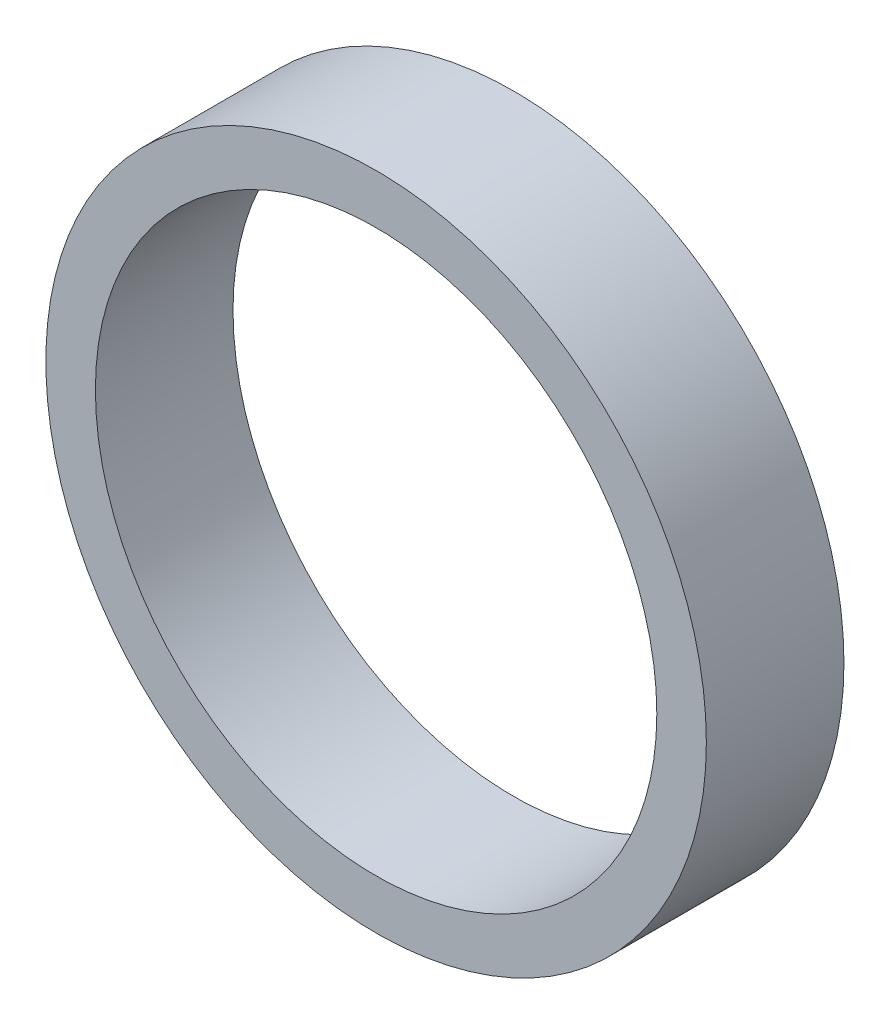
ISO-10303-21;
HEADER;
FILE_DESCRIPTION(('STEP AP214'),'2;1');
FILE_NAME('part.step','',(''),(''),'','','');
FILE_SCHEMA(('AUTOMOTIVE_DESIGN { 1 0 10303 214 1 1 1 1 }'));
ENDSEC;
DATA;
#1=APPLICATION_CONTEXT('core data for automotive mechanical design processes');
#2=APPLICATION_PROTOCOL_DEFINITION('international standard','automotive_design',2000,#1);
#3=PRODUCT_CONTEXT('',#1,'mechanical');
#4=PRODUCT('Part','Part','',(#3));
#5=PRODUCT_RELATED_PRODUCT_CATEGORY('part','',(#4));
#6=PRODUCT_DEFINITION_FORMATION('','',#4);
#7=PRODUCT_DEFINITION_CONTEXT('part definition',#1,'design');
#8=PRODUCT_DEFINITION('design','',#6,#7);
#9=PRODUCT_DEFINITION_SHAPE('','',#8);
#10=(LENGTH_UNIT() NAMED_UNIT(*) SI_UNIT(.MILLI.,.METRE.));
#11=(NAMED_UNIT(*) PLANE_ANGLE_UNIT() SI_UNIT($,.RADIAN.));
#12=(NAMED_UNIT(*) SI_UNIT($,.STERADIAN.) SOLID_ANGLE_UNIT());
#13=UNCERTAINTY_MEASURE_WITH_UNIT(LENGTH_MEASURE(1.E-05),#10,'distance_accuracy_value','');
#14=(GEOMETRIC_REPRESENTATION_CONTEXT(3) GLOBAL_UNCERTAINTY_ASSIGNED_CONTEXT((#13)) GLOBAL_UNIT_ASSIGNED_CONTEXT((#10,
#11,#12)) REPRESENTATION_CONTEXT('',''));
#15=CARTESIAN_POINT('',(0.,0.,0.));
#16=DIRECTION('',(0.,0.,1.));
#17=DIRECTION('',(1.,0.,0.));
#18=AXIS2_PLACEMENT_3D('',#15,#16,#17);
#19=CARTESIAN_POINT('',(0.,0.,2.5));
#20=DIRECTION('',(0.,0.,1.));
#21=DIRECTION('',(1.,0.,0.));
#22=AXIS2_PLACEMENT_3D('',#19,#20,#21);
#23=PLANE('',#22);
#24=CARTESIAN_POINT('',(0.,0.,2.5));
#25=DIRECTION('',(0.,0.,1.));
#26=DIRECTION('',(1.,0.,0.));
#27=AXIS2_PLACEMENT_3D('',#24,#25,#26);
#28=CIRCLE('',#27,6.);
#29=CARTESIAN_POINT('',(6.,0.,2.5));
#30=VERTEX_POINT('',#29);
#31=EDGE_CURVE('E10',#30,#30,#28,.T.);
#32=ORIENTED_EDGE('',*,*,#31,.T.);
#33=EDGE_LOOP('',(#32));
#34=FACE_BOUND('',#33,.T.);
#35=CARTESIAN_POINT('',(0.,0.,2.5));
#36=DIRECTION('',(0.,0.,1.));
#37=DIRECTION('',(1.,0.,0.));
#38=AXIS2_PLACEMENT_3D('',#35,#36,#37);
#39=CIRCLE('',#38,5.1);
#40=CARTESIAN_POINT('',(5.1,0.,2.5));
#41=VERTEX_POINT('',#40);
#42=EDGE_CURVE('E64',#41,#41,#39,.T.);
#43=ORIENTED_EDGE('',*,*,#42,.F.);
#44=EDGE_LOOP('',(#43));
#45=FACE_BOUND('',#44,.T.);
#46=ADVANCED_FACE('F49',(#34,#45),#23,.T.);
#47=CARTESIAN_POINT('',(0.,0.,0.));
#48=DIRECTION('',(0.,0.,1.));
#49=DIRECTION('',(1.,0.,0.));
#50=AXIS2_PLACEMENT_3D('',#47,#48,#49);
#51=PLANE('',#50);
#52=CARTESIAN_POINT('',(0.,0.,0.));
#53=DIRECTION('',(0.,0.,1.));
#54=DIRECTION('',(1.,0.,0.));
#55=AXIS2_PLACEMENT_3D('',#52,#53,#54);
#56=CIRCLE('',#55,6.);
#57=CARTESIAN_POINT('',(6.,0.,0.));
#58=VERTEX_POINT('',#57);
#59=EDGE_CURVE('E53',#58,#58,#56,.T.);
#60=ORIENTED_EDGE('',*,*,#59,.F.);
#61=EDGE_LOOP('',(#60));
#62=FACE_BOUND('',#61,.T.);
#63=CARTESIAN_POINT('',(0.,0.,0.));
#64=DIRECTION('',(0.,0.,1.));
#65=DIRECTION('',(1.,0.,0.));
#66=AXIS2_PLACEMENT_3D('',#63,#64,#65);
#67=CIRCLE('',#66,5.1);
#68=CARTESIAN_POINT('',(5.1,0.,0.));
#69=VERTEX_POINT('',#68);
#70=EDGE_CURVE('E66',#69,#69,#67,.T.);
#71=ORIENTED_EDGE('',*,*,#70,.T.);
#72=EDGE_LOOP('',(#71));
#73=FACE_BOUND('',#72,.T.);
#74=ADVANCED_FACE('F78',(#62,#73),#51,.F.);
#75=CARTESIAN_POINT('',(0.,0.,2.5));
#76=DIRECTION('',(0.,0.,-1.));
#77=DIRECTION('',(-1.,0.,0.));
#78=AXIS2_PLACEMENT_3D('',#75,#76,#77);
#79=CYLINDRICAL_SURFACE('',#78,6.);
#80=ORIENTED_EDGE('',*,*,#31,.F.);
#81=EDGE_LOOP('',(#80));
#82=FACE_BOUND('',#81,.T.);
#83=ORIENTED_EDGE('',*,*,#59,.T.);
#84=EDGE_LOOP('',(#83));
#85=FACE_BOUND('',#84,.T.);
#86=ADVANCED_FACE('F51',(#82,#85),#79,.T.);
#87=CARTESIAN_POINT('',(0.,0.,2.5));
#88=DIRECTION('',(0.,0.,-1.));
#89=DIRECTION('',(-1.,0.,0.));
#90=AXIS2_PLACEMENT_3D('',#87,#88,#89);
#91=CYLINDRICAL_SURFACE('',#90,5.1);
#92=ORIENTED_EDGE('',*,*,#42,.T.);
#93=EDGE_LOOP('',(#92));
#94=FACE_BOUND('',#93,.T.);
#95=ORIENTED_EDGE('',*,*,#70,.F.);
#96=EDGE_LOOP('',(#95));
#97=FACE_BOUND('',#96,.T.);
#98=ADVANCED_FACE('F74',(#94,#97),#91,.F.);
#99=CLOSED_SHELL('',(#46,#74,#86,#98));
#100=MANIFOLD_SOLID_BREP('B2',#99);
#101=ADVANCED_BREP_SHAPE_REPRESENTATION('',(#18,#100),#14);
#102=SHAPE_DEFINITION_REPRESENTATION(#9,#101);
ENDSEC;
END-ISO-10303-21;
